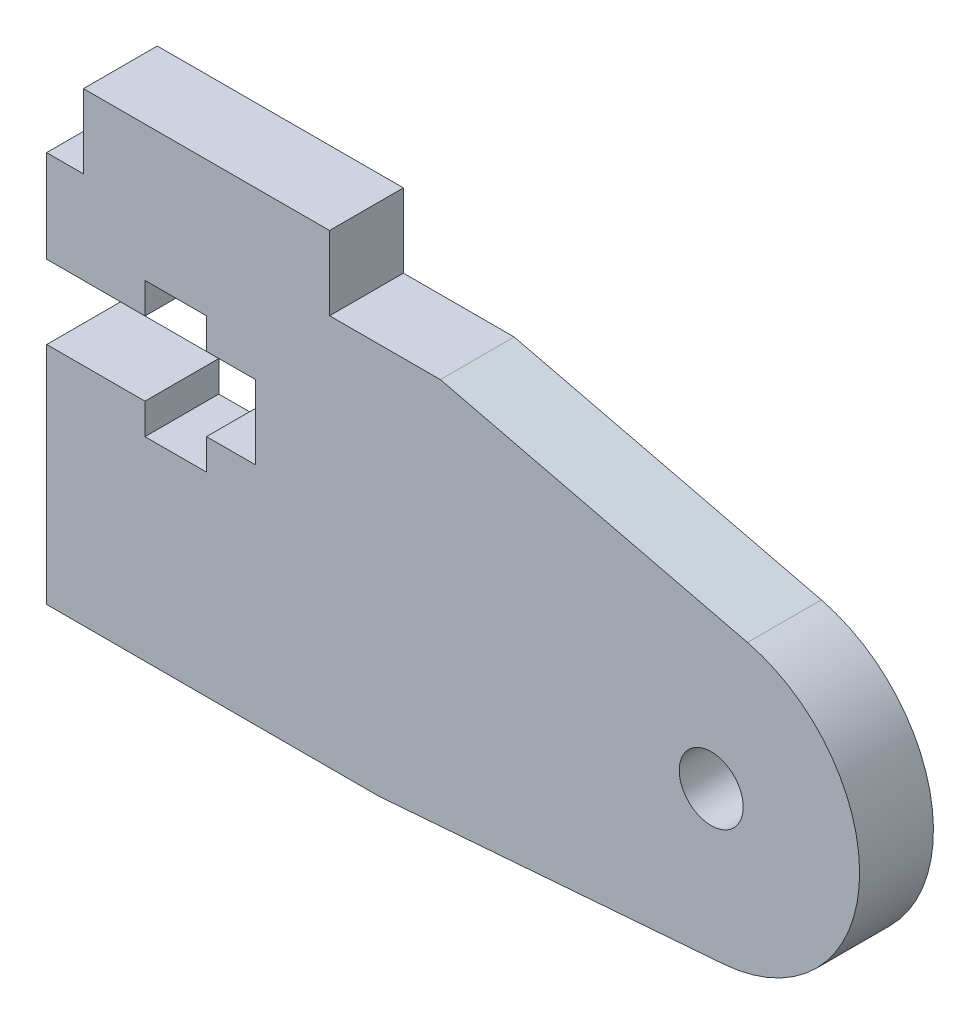
ISO-10303-21;
HEADER;
FILE_DESCRIPTION(('STEP AP214'),'2;1');
FILE_NAME('part.step','',(''),(''),'','','');
FILE_SCHEMA(('AUTOMOTIVE_DESIGN { 1 0 10303 214 1 1 1 1 }'));
ENDSEC;
DATA;
#1=APPLICATION_CONTEXT('core data for automotive mechanical design processes');
#2=APPLICATION_PROTOCOL_DEFINITION('international standard','automotive_design',2000,#1);
#3=PRODUCT_CONTEXT('',#1,'mechanical');
#4=PRODUCT('Part','Part','',(#3));
#5=PRODUCT_RELATED_PRODUCT_CATEGORY('part','',(#4));
#6=PRODUCT_DEFINITION_FORMATION('','',#4);
#7=PRODUCT_DEFINITION_CONTEXT('part definition',#1,'design');
#8=PRODUCT_DEFINITION('design','',#6,#7);
#9=PRODUCT_DEFINITION_SHAPE('','',#8);
#10=(LENGTH_UNIT() NAMED_UNIT(*) SI_UNIT(.MILLI.,.METRE.));
#11=(NAMED_UNIT(*) PLANE_ANGLE_UNIT() SI_UNIT($,.RADIAN.));
#12=(NAMED_UNIT(*) SI_UNIT($,.STERADIAN.) SOLID_ANGLE_UNIT());
#13=UNCERTAINTY_MEASURE_WITH_UNIT(LENGTH_MEASURE(1.E-05),#10,'distance_accuracy_value','');
#14=(GEOMETRIC_REPRESENTATION_CONTEXT(3) GLOBAL_UNCERTAINTY_ASSIGNED_CONTEXT((#13)) GLOBAL_UNIT_ASSIGNED_CONTEXT((#10,
#11,#12)) REPRESENTATION_CONTEXT('',''));
#15=CARTESIAN_POINT('',(0.,0.,0.));
#16=DIRECTION('',(0.,0.,1.));
#17=DIRECTION('',(1.,0.,0.));
#18=AXIS2_PLACEMENT_3D('',#15,#16,#17);
#19=CARTESIAN_POINT('',(237.032145776657,76.1590952958607,3.));
#20=DIRECTION('',(0.,0.,-1.));
#21=DIRECTION('',(-1.,0.,0.));
#22=AXIS2_PLACEMENT_3D('',#19,#20,#21);
#23=PLANE('',#22);
#24=DIRECTION('',(-0.999999690037696,-0.000787352850854752,0.));
#25=VECTOR('',#24,1.);
#26=CARTESIAN_POINT('',(218.49263232379,78.2356668376269,3.));
#27=LINE('',#26,#25);
#28=CARTESIAN_POINT('',(218.49263232379,78.2356668376269,3.));
#29=VERTEX_POINT('',#28);
#30=CARTESIAN_POINT('',(216.492632943714,78.2340921319252,3.));
#31=VERTEX_POINT('',#30);
#32=EDGE_CURVE('E257',#29,#31,#27,.T.);
#33=ORIENTED_EDGE('',*,*,#32,.T.);
#34=DIRECTION('',(0.000787352850806175,-0.999999690037696,0.));
#35=VECTOR('',#34,1.);
#36=CARTESIAN_POINT('',(216.492632943714,78.2340921319252,3.));
#37=LINE('',#36,#35);
#38=CARTESIAN_POINT('',(216.493617134778,76.984092519378,3.));
#39=VERTEX_POINT('',#38);
#40=EDGE_CURVE('E135',#31,#39,#37,.T.);
#41=ORIENTED_EDGE('',*,*,#40,.T.);
#42=DIRECTION('',(-0.999999690037696,-0.000787352850806297,0.));
#43=VECTOR('',#42,1.);
#44=CARTESIAN_POINT('',(216.493617134778,76.984092519378,3.));
#45=LINE('',#44,#43);
#46=CARTESIAN_POINT('',(213.993617909684,76.982124137251,3.));
#47=VERTEX_POINT('',#46);
#48=EDGE_CURVE('E314',#39,#47,#45,.T.);
#49=ORIENTED_EDGE('',*,*,#48,.T.);
#50=DIRECTION('',(-0.000787352850783962,0.999999690037696,0.));
#51=VECTOR('',#50,1.);
#52=CARTESIAN_POINT('',(213.993617909684,76.982124137251,3.));
#53=LINE('',#52,#51);
#54=CARTESIAN_POINT('',(213.992633718621,78.2321237497982,3.));
#55=VERTEX_POINT('',#54);
#56=EDGE_CURVE('E333',#47,#55,#53,.T.);
#57=ORIENTED_EDGE('',*,*,#56,.T.);
#58=DIRECTION('',(-0.999999690037695,-0.000787352852058484,0.));
#59=VECTOR('',#58,1.);
#60=CARTESIAN_POINT('',(213.992633718621,78.2321237497982,3.));
#61=LINE('',#60,#59);
#62=CARTESIAN_POINT('',(210.000112684434,78.2289802260007,3.));
#63=VERTEX_POINT('',#62);
#64=EDGE_CURVE('E330',#55,#63,#61,.T.);
#65=ORIENTED_EDGE('',*,*,#64,.T.);
#66=DIRECTION('',(-2.68532884352199E-05,-0.999999999639451,0.));
#67=VECTOR('',#66,1.);
#68=CARTESIAN_POINT('',(210.000112684434,78.2289802260007,3.));
#69=LINE('',#68,#67);
#70=CARTESIAN_POINT('',(209.999867004229,69.08,3.));
#71=VERTEX_POINT('',#70);
#72=EDGE_CURVE('E332',#63,#71,#69,.T.);
#73=ORIENTED_EDGE('',*,*,#72,.T.);
#74=DIRECTION('',(1.,0.,0.));
#75=VECTOR('',#74,1.);
#76=CARTESIAN_POINT('',(209.999867004229,69.08,3.));
#77=LINE('',#76,#75);
#78=CARTESIAN_POINT('',(223.4882426402,69.08,3.));
#79=VERTEX_POINT('',#78);
#80=EDGE_CURVE('E335',#71,#79,#77,.T.);
#81=ORIENTED_EDGE('',*,*,#80,.T.);
#82=DIRECTION('',(0.996947099942349,0.0780799584819332,0.));
#83=VECTOR('',#82,1.);
#84=CARTESIAN_POINT('',(223.4882426402,69.08,3.));
#85=LINE('',#84,#83);
#86=CARTESIAN_POINT('',(237.517934203416,70.1787922376559,3.));
#87=VERTEX_POINT('',#86);
#88=EDGE_CURVE('E341',#79,#87,#85,.T.);
#89=ORIENTED_EDGE('',*,*,#88,.T.);
#90=CARTESIAN_POINT('',(237.032145776657,76.1590952958607,3.));
#91=DIRECTION('',(0.,0.,1.));
#92=DIRECTION('',(-1.,0.,0.));
#93=AXIS2_PLACEMENT_3D('',#90,#91,#92);
#94=CIRCLE('',#93,6.00000125529538);
#95=CARTESIAN_POINT('',(238.477244303843,81.9824710617094,3.));
#96=VERTEX_POINT('',#95);
#97=EDGE_CURVE('E343',#87,#96,#94,.T.);
#98=ORIENTED_EDGE('',*,*,#97,.T.);
#99=DIRECTION('',(-0.972152676146553,0.23434840358128,0.));
#100=VECTOR('',#99,1.);
#101=CARTESIAN_POINT('',(238.477244303843,81.9824710617094,3.));
#102=LINE('',#101,#100);
#103=CARTESIAN_POINT('',(225.994777469297,84.9915109452669,3.));
#104=VERTEX_POINT('',#103);
#105=EDGE_CURVE('E345',#96,#104,#102,.T.);
#106=ORIENTED_EDGE('',*,*,#105,.T.);
#107=DIRECTION('',(-0.999999690037696,-0.000787352850732143,0.));
#108=VECTOR('',#107,1.);
#109=CARTESIAN_POINT('',(225.994777469297,84.9915109452669,3.));
#110=LINE('',#109,#108);
#111=CARTESIAN_POINT('',(221.494778864126,84.9879678574386,3.));
#112=VERTEX_POINT('',#111);
#113=EDGE_CURVE('E347',#104,#112,#110,.T.);
#114=ORIENTED_EDGE('',*,*,#113,.T.);
#115=DIRECTION('',(-0.00078735285083274,0.999999690037696,0.));
#116=VECTOR('',#115,1.);
#117=CARTESIAN_POINT('',(221.494778864126,84.9879678574386,3.));
#118=LINE('',#117,#116);
#119=CARTESIAN_POINT('',(221.492416805574,87.9879669275564,3.));
#120=VERTEX_POINT('',#119);
#121=EDGE_CURVE('E349',#112,#120,#118,.T.);
#122=ORIENTED_EDGE('',*,*,#121,.T.);
#123=DIRECTION('',(-0.999999690037696,-0.000787352850811783,0.));
#124=VECTOR('',#123,1.);
#125=CARTESIAN_POINT('',(211.492419905197,87.9800933990483,3.));
#126=LINE('',#125,#124);
#127=CARTESIAN_POINT('',(211.492419905197,87.9800933990483,3.));
#128=VERTEX_POINT('',#127);
#129=EDGE_CURVE('E351',#120,#128,#126,.T.);
#130=ORIENTED_EDGE('',*,*,#129,.T.);
#131=DIRECTION('',(0.000787352850787719,-0.999999690037696,0.));
#132=VECTOR('',#131,1.);
#133=CARTESIAN_POINT('',(211.49478196375,84.9800943289352,3.));
#134=LINE('',#133,#132);
#135=CARTESIAN_POINT('',(211.49478196375,84.9800943289352,3.));
#136=VERTEX_POINT('',#135);
#137=EDGE_CURVE('E353',#128,#136,#134,.T.);
#138=ORIENTED_EDGE('',*,*,#137,.T.);
#139=DIRECTION('',(-0.999999690037696,-0.000787352850800912,0.));
#140=VECTOR('',#139,1.);
#141=CARTESIAN_POINT('',(209.9947824287,84.978913299659,3.));
#142=LINE('',#141,#140);
#143=CARTESIAN_POINT('',(209.9947824287,84.978913299659,3.));
#144=VERTEX_POINT('',#143);
#145=EDGE_CURVE('E355',#136,#144,#142,.T.);
#146=ORIENTED_EDGE('',*,*,#145,.T.);
#147=DIRECTION('',(0.00079024558216566,-0.999999687755911,0.));
#148=VECTOR('',#147,1.);
#149=CARTESIAN_POINT('',(209.997745798408,81.2289792923177,3.));
#150=LINE('',#149,#148);
#151=CARTESIAN_POINT('',(209.997745798408,81.2289792923177,3.));
#152=VERTEX_POINT('',#151);
#153=EDGE_CURVE('E357',#144,#152,#150,.T.);
#154=ORIENTED_EDGE('',*,*,#153,.T.);
#155=DIRECTION('',(0.999999690037696,0.000787352850788518,0.));
#156=VECTOR('',#155,1.);
#157=CARTESIAN_POINT('',(209.997745798408,81.2289792923177,3.));
#158=LINE('',#157,#156);
#159=CARTESIAN_POINT('',(213.997733687767,81.2321286951617,3.));
#160=VERTEX_POINT('',#159);
#161=EDGE_CURVE('E359',#152,#160,#158,.T.);
#162=ORIENTED_EDGE('',*,*,#161,.T.);
#163=DIRECTION('',(-0.000787352850761819,0.999999690037696,0.));
#164=VECTOR('',#163,1.);
#165=CARTESIAN_POINT('',(213.997733687767,81.2321286951617,3.));
#166=LINE('',#165,#164);
#167=CARTESIAN_POINT('',(213.996749496704,82.4821283077088,3.));
#168=VERTEX_POINT('',#167);
#169=EDGE_CURVE('E361',#160,#168,#166,.T.);
#170=ORIENTED_EDGE('',*,*,#169,.T.);
#171=DIRECTION('',(0.999999690037696,0.000787352850760506,0.));
#172=VECTOR('',#171,1.);
#173=CARTESIAN_POINT('',(213.996749496704,82.4821283077088,3.));
#174=LINE('',#173,#172);
#175=CARTESIAN_POINT('',(216.489286694099,82.4840908145851,3.));
#176=VERTEX_POINT('',#175);
#177=EDGE_CURVE('E196',#168,#176,#174,.T.);
#178=ORIENTED_EDGE('',*,*,#177,.T.);
#179=DIRECTION('',(0.000787352850828563,-0.999999690037696,0.));
#180=VECTOR('',#179,1.);
#181=CARTESIAN_POINT('',(216.489286694099,82.4840908145851,3.));
#182=LINE('',#181,#180);
#183=CARTESIAN_POINT('',(216.490270885163,81.2340912020382,3.));
#184=VERTEX_POINT('',#183);
#185=EDGE_CURVE('E190',#176,#184,#182,.T.);
#186=ORIENTED_EDGE('',*,*,#185,.T.);
#187=DIRECTION('',(0.999999690037696,0.000787352850854959,0.));
#188=VECTOR('',#187,1.);
#189=CARTESIAN_POINT('',(216.490270885163,81.2340912020382,3.));
#190=LINE('',#189,#188);
#191=CARTESIAN_POINT('',(218.490270265237,81.2356659077399,3.));
#192=VERTEX_POINT('',#191);
#193=EDGE_CURVE('E194',#184,#192,#190,.T.);
#194=ORIENTED_EDGE('',*,*,#193,.T.);
#195=DIRECTION('',(0.000787352850834,-0.999999690037696,0.));
#196=VECTOR('',#195,1.);
#197=CARTESIAN_POINT('',(218.490270265237,81.2356659077399,3.));
#198=LINE('',#197,#196);
#199=EDGE_CURVE('E50',#192,#29,#198,.T.);
#200=ORIENTED_EDGE('',*,*,#199,.T.);
#201=EDGE_LOOP('',(#33,#41,#49,#57,#65,#73,#81,#89,#98,#106,#114,#122,#130,#138,#146,#154,#162,
#170,#178,#186,#194,#200));
#202=FACE_BOUND('',#201,.T.);
#203=CARTESIAN_POINT('',(237.001781500083,76.1001745852953,3.));
#204=DIRECTION('',(0.,0.,1.));
#205=DIRECTION('',(1.,0.,0.));
#206=AXIS2_PLACEMENT_3D('',#203,#204,#205);
#207=CIRCLE('',#206,1.30000000000001);
#208=CARTESIAN_POINT('',(238.301781500083,76.1001745852953,3.));
#209=VERTEX_POINT('',#208);
#210=EDGE_CURVE('E218',#209,#209,#207,.T.);
#211=ORIENTED_EDGE('',*,*,#210,.F.);
#212=EDGE_LOOP('',(#211));
#213=FACE_BOUND('',#212,.T.);
#214=ADVANCED_FACE('F33',(#202,#213),#23,.F.);
#215=CARTESIAN_POINT('',(237.032145776657,76.1590952958607,0.));
#216=DIRECTION('',(0.,0.,-1.));
#217=DIRECTION('',(-1.,0.,0.));
#218=AXIS2_PLACEMENT_3D('',#215,#216,#217);
#219=PLANE('',#218);
#220=DIRECTION('',(-0.999999690037696,-0.000787352850854752,0.));
#221=VECTOR('',#220,1.);
#222=CARTESIAN_POINT('',(218.49263232379,78.2356668376269,0.));
#223=LINE('',#222,#221);
#224=CARTESIAN_POINT('',(218.49263232379,78.2356668376269,0.));
#225=VERTEX_POINT('',#224);
#226=CARTESIAN_POINT('',(216.492632943714,78.2340921319252,0.));
#227=VERTEX_POINT('',#226);
#228=EDGE_CURVE('E214',#225,#227,#223,.T.);
#229=ORIENTED_EDGE('',*,*,#228,.F.);
#230=DIRECTION('',(0.000787352850834,-0.999999690037696,0.));
#231=VECTOR('',#230,1.);
#232=CARTESIAN_POINT('',(218.490270265237,81.2356659077399,0.));
#233=LINE('',#232,#231);
#234=CARTESIAN_POINT('',(218.490270265237,81.2356659077399,0.));
#235=VERTEX_POINT('',#234);
#236=EDGE_CURVE('E127',#235,#225,#233,.T.);
#237=ORIENTED_EDGE('',*,*,#236,.F.);
#238=DIRECTION('',(0.999999690037696,0.000787352850854959,0.));
#239=VECTOR('',#238,1.);
#240=CARTESIAN_POINT('',(216.490270885163,81.2340912020382,0.));
#241=LINE('',#240,#239);
#242=CARTESIAN_POINT('',(216.490270885163,81.2340912020382,0.));
#243=VERTEX_POINT('',#242);
#244=EDGE_CURVE('E121',#243,#235,#241,.T.);
#245=ORIENTED_EDGE('',*,*,#244,.F.);
#246=DIRECTION('',(0.000787352850828563,-0.999999690037696,0.));
#247=VECTOR('',#246,1.);
#248=CARTESIAN_POINT('',(216.489286694099,82.4840908145851,0.));
#249=LINE('',#248,#247);
#250=CARTESIAN_POINT('',(216.489286694099,82.4840908145851,0.));
#251=VERTEX_POINT('',#250);
#252=EDGE_CURVE('E204',#251,#243,#249,.T.);
#253=ORIENTED_EDGE('',*,*,#252,.F.);
#254=DIRECTION('',(0.999999690037696,0.000787352850760506,0.));
#255=VECTOR('',#254,1.);
#256=CARTESIAN_POINT('',(213.996749496704,82.4821283077088,0.));
#257=LINE('',#256,#255);
#258=CARTESIAN_POINT('',(213.996749496704,82.4821283077088,0.));
#259=VERTEX_POINT('',#258);
#260=EDGE_CURVE('E252',#259,#251,#257,.T.);
#261=ORIENTED_EDGE('',*,*,#260,.F.);
#262=DIRECTION('',(-0.000787352850761819,0.999999690037696,0.));
#263=VECTOR('',#262,1.);
#264=CARTESIAN_POINT('',(213.997733687767,81.2321286951617,0.));
#265=LINE('',#264,#263);
#266=CARTESIAN_POINT('',(213.997733687767,81.2321286951617,0.));
#267=VERTEX_POINT('',#266);
#268=EDGE_CURVE('E250',#267,#259,#265,.T.);
#269=ORIENTED_EDGE('',*,*,#268,.F.);
#270=DIRECTION('',(0.999999690037696,0.000787352850788518,0.));
#271=VECTOR('',#270,1.);
#272=CARTESIAN_POINT('',(209.997745798408,81.2289792923177,0.));
#273=LINE('',#272,#271);
#274=CARTESIAN_POINT('',(209.997745798408,81.2289792923177,0.));
#275=VERTEX_POINT('',#274);
#276=EDGE_CURVE('E248',#275,#267,#273,.T.);
#277=ORIENTED_EDGE('',*,*,#276,.F.);
#278=DIRECTION('',(0.00079024558216566,-0.999999687755911,0.));
#279=VECTOR('',#278,1.);
#280=CARTESIAN_POINT('',(209.997745798408,81.2289792923177,0.));
#281=LINE('',#280,#279);
#282=CARTESIAN_POINT('',(209.9947824287,84.978913299659,0.));
#283=VERTEX_POINT('',#282);
#284=EDGE_CURVE('E246',#283,#275,#281,.T.);
#285=ORIENTED_EDGE('',*,*,#284,.F.);
#286=DIRECTION('',(-0.999999690037696,-0.000787352850800912,0.));
#287=VECTOR('',#286,1.);
#288=CARTESIAN_POINT('',(209.9947824287,84.978913299659,0.));
#289=LINE('',#288,#287);
#290=CARTESIAN_POINT('',(211.49478196375,84.9800943289352,0.));
#291=VERTEX_POINT('',#290);
#292=EDGE_CURVE('E244',#291,#283,#289,.T.);
#293=ORIENTED_EDGE('',*,*,#292,.F.);
#294=DIRECTION('',(0.000787352850787719,-0.999999690037696,0.));
#295=VECTOR('',#294,1.);
#296=CARTESIAN_POINT('',(211.49478196375,84.9800943289352,0.));
#297=LINE('',#296,#295);
#298=CARTESIAN_POINT('',(211.492419905197,87.9800933990483,0.));
#299=VERTEX_POINT('',#298);
#300=EDGE_CURVE('E242',#299,#291,#297,.T.);
#301=ORIENTED_EDGE('',*,*,#300,.F.);
#302=DIRECTION('',(-0.999999690037696,-0.000787352850811783,0.));
#303=VECTOR('',#302,1.);
#304=CARTESIAN_POINT('',(211.492419905197,87.9800933990483,0.));
#305=LINE('',#304,#303);
#306=CARTESIAN_POINT('',(221.492416805574,87.9879669275564,0.));
#307=VERTEX_POINT('',#306);
#308=EDGE_CURVE('E240',#307,#299,#305,.T.);
#309=ORIENTED_EDGE('',*,*,#308,.F.);
#310=DIRECTION('',(-0.00078735285083274,0.999999690037696,0.));
#311=VECTOR('',#310,1.);
#312=CARTESIAN_POINT('',(221.494778864126,84.9879678574386,0.));
#313=LINE('',#312,#311);
#314=CARTESIAN_POINT('',(221.494778864126,84.9879678574386,0.));
#315=VERTEX_POINT('',#314);
#316=EDGE_CURVE('E238',#315,#307,#313,.T.);
#317=ORIENTED_EDGE('',*,*,#316,.F.);
#318=DIRECTION('',(-0.999999690037696,-0.000787352850732143,0.));
#319=VECTOR('',#318,1.);
#320=CARTESIAN_POINT('',(225.994777469297,84.9915109452669,0.));
#321=LINE('',#320,#319);
#322=CARTESIAN_POINT('',(225.994777469297,84.9915109452669,0.));
#323=VERTEX_POINT('',#322);
#324=EDGE_CURVE('E236',#323,#315,#321,.T.);
#325=ORIENTED_EDGE('',*,*,#324,.F.);
#326=DIRECTION('',(-0.972152676146553,0.23434840358128,0.));
#327=VECTOR('',#326,1.);
#328=CARTESIAN_POINT('',(238.477244303843,81.9824710617094,0.));
#329=LINE('',#328,#327);
#330=CARTESIAN_POINT('',(238.477244303843,81.9824710617094,0.));
#331=VERTEX_POINT('',#330);
#332=EDGE_CURVE('E234',#331,#323,#329,.T.);
#333=ORIENTED_EDGE('',*,*,#332,.F.);
#334=CARTESIAN_POINT('',(237.032145776657,76.1590952958607,0.));
#335=DIRECTION('',(0.,0.,1.));
#336=DIRECTION('',(-1.,0.,0.));
#337=AXIS2_PLACEMENT_3D('',#334,#335,#336);
#338=CIRCLE('',#337,6.00000125529538);
#339=CARTESIAN_POINT('',(237.517934203416,70.1787922376559,0.));
#340=VERTEX_POINT('',#339);
#341=EDGE_CURVE('E232',#340,#331,#338,.T.);
#342=ORIENTED_EDGE('',*,*,#341,.F.);
#343=DIRECTION('',(0.996947099942349,0.0780799584819332,0.));
#344=VECTOR('',#343,1.);
#345=CARTESIAN_POINT('',(223.4882426402,69.08,0.));
#346=LINE('',#345,#344);
#347=CARTESIAN_POINT('',(223.4882426402,69.08,0.));
#348=VERTEX_POINT('',#347);
#349=EDGE_CURVE('E230',#348,#340,#346,.T.);
#350=ORIENTED_EDGE('',*,*,#349,.F.);
#351=DIRECTION('',(1.,0.,0.));
#352=VECTOR('',#351,1.);
#353=CARTESIAN_POINT('',(209.999867004229,69.08,0.));
#354=LINE('',#353,#352);
#355=CARTESIAN_POINT('',(209.999867004229,69.08,0.));
#356=VERTEX_POINT('',#355);
#357=EDGE_CURVE('E228',#356,#348,#354,.T.);
#358=ORIENTED_EDGE('',*,*,#357,.F.);
#359=DIRECTION('',(-2.68532884352199E-05,-0.999999999639451,0.));
#360=VECTOR('',#359,1.);
#361=CARTESIAN_POINT('',(210.000112684434,78.2289802260007,0.));
#362=LINE('',#361,#360);
#363=CARTESIAN_POINT('',(210.000112684434,78.2289802260007,0.));
#364=VERTEX_POINT('',#363);
#365=EDGE_CURVE('E226',#364,#356,#362,.T.);
#366=ORIENTED_EDGE('',*,*,#365,.F.);
#367=DIRECTION('',(-0.999999690037695,-0.000787352852058484,0.));
#368=VECTOR('',#367,1.);
#369=CARTESIAN_POINT('',(213.992633718621,78.2321237497982,0.));
#370=LINE('',#369,#368);
#371=CARTESIAN_POINT('',(213.992633718621,78.2321237497982,0.));
#372=VERTEX_POINT('',#371);
#373=EDGE_CURVE('E224',#372,#364,#370,.T.);
#374=ORIENTED_EDGE('',*,*,#373,.F.);
#375=DIRECTION('',(-0.000787352850783962,0.999999690037696,0.));
#376=VECTOR('',#375,1.);
#377=CARTESIAN_POINT('',(213.993617909684,76.982124137251,0.));
#378=LINE('',#377,#376);
#379=CARTESIAN_POINT('',(213.993617909684,76.982124137251,0.));
#380=VERTEX_POINT('',#379);
#381=EDGE_CURVE('E222',#380,#372,#378,.T.);
#382=ORIENTED_EDGE('',*,*,#381,.F.);
#383=DIRECTION('',(-0.999999690037696,-0.000787352850806297,0.));
#384=VECTOR('',#383,1.);
#385=CARTESIAN_POINT('',(216.493617134778,76.984092519378,0.));
#386=LINE('',#385,#384);
#387=CARTESIAN_POINT('',(216.493617134778,76.984092519378,0.));
#388=VERTEX_POINT('',#387);
#389=EDGE_CURVE('E220',#388,#380,#386,.T.);
#390=ORIENTED_EDGE('',*,*,#389,.F.);
#391=DIRECTION('',(0.000787352850806175,-0.999999690037696,0.));
#392=VECTOR('',#391,1.);
#393=CARTESIAN_POINT('',(216.492632943714,78.2340921319252,0.));
#394=LINE('',#393,#392);
#395=EDGE_CURVE('E217',#227,#388,#394,.T.);
#396=ORIENTED_EDGE('',*,*,#395,.F.);
#397=EDGE_LOOP('',(#229,#237,#245,#253,#261,#269,#277,#285,#293,#301,#309,#317,#325,#333,#342,
#350,#358,#366,#374,#382,#390,#396));
#398=FACE_BOUND('',#397,.T.);
#399=CARTESIAN_POINT('',(237.001781500083,76.1001745852953,0.));
#400=DIRECTION('',(0.,0.,1.));
#401=DIRECTION('',(1.,0.,0.));
#402=AXIS2_PLACEMENT_3D('',#399,#400,#401);
#403=CIRCLE('',#402,1.30000000000001);
#404=CARTESIAN_POINT('',(238.301781500083,76.1001745852953,0.));
#405=VERTEX_POINT('',#404);
#406=EDGE_CURVE('E638',#405,#405,#403,.T.);
#407=ORIENTED_EDGE('',*,*,#406,.T.);
#408=EDGE_LOOP('',(#407));
#409=FACE_BOUND('',#408,.T.);
#410=ADVANCED_FACE('F318',(#398,#409),#219,.T.);
#411=CARTESIAN_POINT('',(218.49263232379,78.2356668376269,3.));
#412=DIRECTION('',(0.000787352850854752,-0.999999690037696,0.));
#413=DIRECTION('',(0.999999690037696,0.000787352850854752,0.));
#414=AXIS2_PLACEMENT_3D('',#411,#412,#413);
#415=PLANE('',#414);
#416=ORIENTED_EDGE('',*,*,#228,.T.);
#417=DIRECTION('',(0.,0.,-1.));
#418=VECTOR('',#417,1.);
#419=CARTESIAN_POINT('',(216.492632943714,78.2340921319252,3.));
#420=LINE('',#419,#418);
#421=EDGE_CURVE('E11',#31,#227,#420,.T.);
#422=ORIENTED_EDGE('',*,*,#421,.F.);
#423=ORIENTED_EDGE('',*,*,#32,.F.);
#424=DIRECTION('',(0.,0.,-1.));
#425=VECTOR('',#424,1.);
#426=CARTESIAN_POINT('',(218.49263232379,78.2356668376269,3.));
#427=LINE('',#426,#425);
#428=EDGE_CURVE('E210',#29,#225,#427,.T.);
#429=ORIENTED_EDGE('',*,*,#428,.T.);
#430=EDGE_LOOP('',(#416,#422,#423,#429));
#431=FACE_BOUND('',#430,.T.);
#432=ADVANCED_FACE('F35',(#431),#415,.F.);
#433=CARTESIAN_POINT('',(216.492632943714,78.2340921319252,3.));
#434=DIRECTION('',(0.999999690037696,0.000787352850806175,0.));
#435=DIRECTION('',(-0.000787352850806175,0.999999690037696,0.));
#436=AXIS2_PLACEMENT_3D('',#433,#434,#435);
#437=PLANE('',#436);
#438=ORIENTED_EDGE('',*,*,#395,.T.);
#439=DIRECTION('',(0.,0.,-1.));
#440=VECTOR('',#439,1.);
#441=CARTESIAN_POINT('',(216.493617134778,76.984092519378,3.));
#442=LINE('',#441,#440);
#443=EDGE_CURVE('E42',#39,#388,#442,.T.);
#444=ORIENTED_EDGE('',*,*,#443,.F.);
#445=ORIENTED_EDGE('',*,*,#40,.F.);
#446=ORIENTED_EDGE('',*,*,#421,.T.);
#447=EDGE_LOOP('',(#438,#444,#445,#446));
#448=FACE_BOUND('',#447,.T.);
#449=ADVANCED_FACE('F395',(#448),#437,.F.);
#450=CARTESIAN_POINT('',(216.493617134778,76.984092519378,3.));
#451=DIRECTION('',(0.000787352850806297,-0.999999690037696,0.));
#452=DIRECTION('',(0.999999690037696,0.000787352850806297,0.));
#453=AXIS2_PLACEMENT_3D('',#450,#451,#452);
#454=PLANE('',#453);
#455=ORIENTED_EDGE('',*,*,#389,.T.);
#456=DIRECTION('',(0.,0.,-1.));
#457=VECTOR('',#456,1.);
#458=CARTESIAN_POINT('',(213.993617909684,76.982124137251,3.));
#459=LINE('',#458,#457);
#460=EDGE_CURVE('E306',#47,#380,#459,.T.);
#461=ORIENTED_EDGE('',*,*,#460,.F.);
#462=ORIENTED_EDGE('',*,*,#48,.F.);
#463=ORIENTED_EDGE('',*,*,#443,.T.);
#464=EDGE_LOOP('',(#455,#461,#462,#463));
#465=FACE_BOUND('',#464,.T.);
#466=ADVANCED_FACE('F312',(#465),#454,.F.);
#467=CARTESIAN_POINT('',(213.993617909684,76.982124137251,3.));
#468=DIRECTION('',(-0.999999690037696,-0.000787352850783962,0.));
#469=DIRECTION('',(0.000787352850783962,-0.999999690037696,0.));
#470=AXIS2_PLACEMENT_3D('',#467,#468,#469);
#471=PLANE('',#470);
#472=ORIENTED_EDGE('',*,*,#381,.T.);
#473=DIRECTION('',(0.,0.,-1.));
#474=VECTOR('',#473,1.);
#475=CARTESIAN_POINT('',(213.992633718621,78.2321237497982,3.));
#476=LINE('',#475,#474);
#477=EDGE_CURVE('E303',#55,#372,#476,.T.);
#478=ORIENTED_EDGE('',*,*,#477,.F.);
#479=ORIENTED_EDGE('',*,*,#56,.F.);
#480=ORIENTED_EDGE('',*,*,#460,.T.);
#481=EDGE_LOOP('',(#472,#478,#479,#480));
#482=FACE_BOUND('',#481,.T.);
#483=ADVANCED_FACE('F324',(#482),#471,.F.);
#484=CARTESIAN_POINT('',(213.992633718621,78.2321237497982,3.));
#485=DIRECTION('',(0.000787352852058484,-0.999999690037695,0.));
#486=DIRECTION('',(0.999999690037695,0.000787352852058484,0.));
#487=AXIS2_PLACEMENT_3D('',#484,#485,#486);
#488=PLANE('',#487);
#489=ORIENTED_EDGE('',*,*,#373,.T.);
#490=DIRECTION('',(0.,0.,-1.));
#491=VECTOR('',#490,1.);
#492=CARTESIAN_POINT('',(210.000112684434,78.2289802260007,3.));
#493=LINE('',#492,#491);
#494=EDGE_CURVE('E300',#63,#364,#493,.T.);
#495=ORIENTED_EDGE('',*,*,#494,.F.);
#496=ORIENTED_EDGE('',*,*,#64,.F.);
#497=ORIENTED_EDGE('',*,*,#477,.T.);
#498=EDGE_LOOP('',(#489,#495,#496,#497));
#499=FACE_BOUND('',#498,.T.);
#500=ADVANCED_FACE('F328',(#499),#488,.F.);
#501=CARTESIAN_POINT('',(210.000112684434,78.2289802260007,3.));
#502=DIRECTION('',(0.99999999963945,-2.68532884352199E-05,0.));
#503=DIRECTION('',(2.68532884352199E-05,0.999999999639451,0.));
#504=AXIS2_PLACEMENT_3D('',#501,#502,#503);
#505=PLANE('',#504);
#506=ORIENTED_EDGE('',*,*,#365,.T.);
#507=DIRECTION('',(0.,0.,-1.));
#508=VECTOR('',#507,1.);
#509=CARTESIAN_POINT('',(209.999867004229,69.08,3.));
#510=LINE('',#509,#508);
#511=EDGE_CURVE('E297',#71,#356,#510,.T.);
#512=ORIENTED_EDGE('',*,*,#511,.F.);
#513=ORIENTED_EDGE('',*,*,#72,.F.);
#514=ORIENTED_EDGE('',*,*,#494,.T.);
#515=EDGE_LOOP('',(#506,#512,#513,#514));
#516=FACE_BOUND('',#515,.T.);
#517=ADVANCED_FACE('F408',(#516),#505,.F.);
#518=CARTESIAN_POINT('',(209.999867004229,69.08,3.));
#519=DIRECTION('',(0.,1.,0.));
#520=DIRECTION('',(0.,0.,1.));
#521=AXIS2_PLACEMENT_3D('',#518,#519,#520);
#522=PLANE('',#521);
#523=ORIENTED_EDGE('',*,*,#357,.T.);
#524=DIRECTION('',(0.,0.,-1.));
#525=VECTOR('',#524,1.);
#526=CARTESIAN_POINT('',(223.4882426402,69.08,3.));
#527=LINE('',#526,#525);
#528=EDGE_CURVE('E294',#79,#348,#527,.T.);
#529=ORIENTED_EDGE('',*,*,#528,.F.);
#530=ORIENTED_EDGE('',*,*,#80,.F.);
#531=ORIENTED_EDGE('',*,*,#511,.T.);
#532=EDGE_LOOP('',(#523,#529,#530,#531));
#533=FACE_BOUND('',#532,.T.);
#534=ADVANCED_FACE('F411',(#533),#522,.F.);
#535=CARTESIAN_POINT('',(223.4882426402,69.08,3.));
#536=DIRECTION('',(-0.0780799584819332,0.996947099942349,0.));
#537=DIRECTION('',(-0.996947099942349,-0.0780799584819332,0.));
#538=AXIS2_PLACEMENT_3D('',#535,#536,#537);
#539=PLANE('',#538);
#540=ORIENTED_EDGE('',*,*,#349,.T.);
#541=DIRECTION('',(0.,0.,-1.));
#542=VECTOR('',#541,1.);
#543=CARTESIAN_POINT('',(237.517934203416,70.1787922376559,3.));
#544=LINE('',#543,#542);
#545=EDGE_CURVE('E291',#87,#340,#544,.T.);
#546=ORIENTED_EDGE('',*,*,#545,.F.);
#547=ORIENTED_EDGE('',*,*,#88,.F.);
#548=ORIENTED_EDGE('',*,*,#528,.T.);
#549=EDGE_LOOP('',(#540,#546,#547,#548));
#550=FACE_BOUND('',#549,.T.);
#551=ADVANCED_FACE('F415',(#550),#539,.F.);
#552=CARTESIAN_POINT('',(237.032145776657,76.1590952958607,3.));
#553=DIRECTION('',(0.,0.,-1.));
#554=DIRECTION('',(-1.,0.,0.));
#555=AXIS2_PLACEMENT_3D('',#552,#553,#554);
#556=CYLINDRICAL_SURFACE('',#555,6.00000125529538);
#557=ORIENTED_EDGE('',*,*,#341,.T.);
#558=DIRECTION('',(0.,0.,-1.));
#559=VECTOR('',#558,1.);
#560=CARTESIAN_POINT('',(238.477244303843,81.9824710617094,3.));
#561=LINE('',#560,#559);
#562=EDGE_CURVE('E288',#96,#331,#561,.T.);
#563=ORIENTED_EDGE('',*,*,#562,.F.);
#564=ORIENTED_EDGE('',*,*,#97,.F.);
#565=ORIENTED_EDGE('',*,*,#545,.T.);
#566=EDGE_LOOP('',(#557,#563,#564,#565));
#567=FACE_BOUND('',#566,.T.);
#568=ADVANCED_FACE('F419',(#567),#556,.T.);
#569=CARTESIAN_POINT('',(238.477244303843,81.9824710617094,3.));
#570=DIRECTION('',(-0.23434840358128,-0.972152676146553,0.));
#571=DIRECTION('',(0.972152676146554,-0.23434840358128,0.));
#572=AXIS2_PLACEMENT_3D('',#569,#570,#571);
#573=PLANE('',#572);
#574=ORIENTED_EDGE('',*,*,#332,.T.);
#575=DIRECTION('',(0.,0.,-1.));
#576=VECTOR('',#575,1.);
#577=CARTESIAN_POINT('',(225.994777469297,84.9915109452669,3.));
#578=LINE('',#577,#576);
#579=EDGE_CURVE('E285',#104,#323,#578,.T.);
#580=ORIENTED_EDGE('',*,*,#579,.F.);
#581=ORIENTED_EDGE('',*,*,#105,.F.);
#582=ORIENTED_EDGE('',*,*,#562,.T.);
#583=EDGE_LOOP('',(#574,#580,#581,#582));
#584=FACE_BOUND('',#583,.T.);
#585=ADVANCED_FACE('F423',(#584),#573,.F.);
#586=CARTESIAN_POINT('',(225.994777469297,84.9915109452669,3.));
#587=DIRECTION('',(0.000787352850732142,-0.999999690037696,0.));
#588=DIRECTION('',(0.999999690037696,0.000787352850732143,0.));
#589=AXIS2_PLACEMENT_3D('',#586,#587,#588);
#590=PLANE('',#589);
#591=ORIENTED_EDGE('',*,*,#324,.T.);
#592=DIRECTION('',(0.,0.,-1.));
#593=VECTOR('',#592,1.);
#594=CARTESIAN_POINT('',(221.494778864126,84.9879678574386,3.));
#595=LINE('',#594,#593);
#596=EDGE_CURVE('E282',#112,#315,#595,.T.);
#597=ORIENTED_EDGE('',*,*,#596,.F.);
#598=ORIENTED_EDGE('',*,*,#113,.F.);
#599=ORIENTED_EDGE('',*,*,#579,.T.);
#600=EDGE_LOOP('',(#591,#597,#598,#599));
#601=FACE_BOUND('',#600,.T.);
#602=ADVANCED_FACE('F427',(#601),#590,.F.);
#603=CARTESIAN_POINT('',(221.494778864126,84.9879678574386,3.));
#604=DIRECTION('',(-0.999999690037696,-0.00078735285083274,0.));
#605=DIRECTION('',(0.00078735285083274,-0.999999690037696,0.));
#606=AXIS2_PLACEMENT_3D('',#603,#604,#605);
#607=PLANE('',#606);
#608=ORIENTED_EDGE('',*,*,#316,.T.);
#609=DIRECTION('',(0.,0.,-1.));
#610=VECTOR('',#609,1.);
#611=CARTESIAN_POINT('',(221.492416805574,87.9879669275564,3.));
#612=LINE('',#611,#610);
#613=EDGE_CURVE('E279',#120,#307,#612,.T.);
#614=ORIENTED_EDGE('',*,*,#613,.F.);
#615=ORIENTED_EDGE('',*,*,#121,.F.);
#616=ORIENTED_EDGE('',*,*,#596,.T.);
#617=EDGE_LOOP('',(#608,#614,#615,#616));
#618=FACE_BOUND('',#617,.T.);
#619=ADVANCED_FACE('F431',(#618),#607,.F.);
#620=CARTESIAN_POINT('',(211.492419905197,87.9800933990483,3.));
#621=DIRECTION('',(0.000787352850811783,-0.999999690037696,0.));
#622=DIRECTION('',(0.999999690037696,0.000787352850811783,0.));
#623=AXIS2_PLACEMENT_3D('',#620,#621,#622);
#624=PLANE('',#623);
#625=ORIENTED_EDGE('',*,*,#308,.T.);
#626=DIRECTION('',(0.,0.,-1.));
#627=VECTOR('',#626,1.);
#628=CARTESIAN_POINT('',(211.492419905197,87.9800933990483,3.));
#629=LINE('',#628,#627);
#630=EDGE_CURVE('E276',#128,#299,#629,.T.);
#631=ORIENTED_EDGE('',*,*,#630,.F.);
#632=ORIENTED_EDGE('',*,*,#129,.F.);
#633=ORIENTED_EDGE('',*,*,#613,.T.);
#634=EDGE_LOOP('',(#625,#631,#632,#633));
#635=FACE_BOUND('',#634,.T.);
#636=ADVANCED_FACE('F435',(#635),#624,.F.);
#637=CARTESIAN_POINT('',(211.49478196375,84.9800943289352,3.));
#638=DIRECTION('',(0.999999690037696,0.000787352850787719,0.));
#639=DIRECTION('',(-0.000787352850787719,0.999999690037696,0.));
#640=AXIS2_PLACEMENT_3D('',#637,#638,#639);
#641=PLANE('',#640);
#642=ORIENTED_EDGE('',*,*,#300,.T.);
#643=DIRECTION('',(0.,0.,-1.));
#644=VECTOR('',#643,1.);
#645=CARTESIAN_POINT('',(211.49478196375,84.9800943289352,3.));
#646=LINE('',#645,#644);
#647=EDGE_CURVE('E273',#136,#291,#646,.T.);
#648=ORIENTED_EDGE('',*,*,#647,.F.);
#649=ORIENTED_EDGE('',*,*,#137,.F.);
#650=ORIENTED_EDGE('',*,*,#630,.T.);
#651=EDGE_LOOP('',(#642,#648,#649,#650));
#652=FACE_BOUND('',#651,.T.);
#653=ADVANCED_FACE('F439',(#652),#641,.F.);
#654=CARTESIAN_POINT('',(209.9947824287,84.978913299659,3.));
#655=DIRECTION('',(0.000787352850800912,-0.999999690037696,0.));
#656=DIRECTION('',(0.999999690037696,0.000787352850800912,0.));
#657=AXIS2_PLACEMENT_3D('',#654,#655,#656);
#658=PLANE('',#657);
#659=ORIENTED_EDGE('',*,*,#292,.T.);
#660=DIRECTION('',(0.,0.,-1.));
#661=VECTOR('',#660,1.);
#662=CARTESIAN_POINT('',(209.9947824287,84.978913299659,3.));
#663=LINE('',#662,#661);
#664=EDGE_CURVE('E270',#144,#283,#663,.T.);
#665=ORIENTED_EDGE('',*,*,#664,.F.);
#666=ORIENTED_EDGE('',*,*,#145,.F.);
#667=ORIENTED_EDGE('',*,*,#647,.T.);
#668=EDGE_LOOP('',(#659,#665,#666,#667));
#669=FACE_BOUND('',#668,.T.);
#670=ADVANCED_FACE('F443',(#669),#658,.F.);
#671=CARTESIAN_POINT('',(209.997745798408,81.2289792923177,3.));
#672=DIRECTION('',(0.999999687755911,0.00079024558216566,0.));
#673=DIRECTION('',(-0.00079024558216566,0.999999687755911,0.));
#674=AXIS2_PLACEMENT_3D('',#671,#672,#673);
#675=PLANE('',#674);
#676=ORIENTED_EDGE('',*,*,#284,.T.);
#677=DIRECTION('',(0.,0.,-1.));
#678=VECTOR('',#677,1.);
#679=CARTESIAN_POINT('',(209.997745798408,81.2289792923177,3.));
#680=LINE('',#679,#678);
#681=EDGE_CURVE('E267',#152,#275,#680,.T.);
#682=ORIENTED_EDGE('',*,*,#681,.F.);
#683=ORIENTED_EDGE('',*,*,#153,.F.);
#684=ORIENTED_EDGE('',*,*,#664,.T.);
#685=EDGE_LOOP('',(#676,#682,#683,#684));
#686=FACE_BOUND('',#685,.T.);
#687=ADVANCED_FACE('F447',(#686),#675,.F.);
#688=CARTESIAN_POINT('',(209.997745798408,81.2289792923177,3.));
#689=DIRECTION('',(-0.000787352850788518,0.999999690037696,0.));
#690=DIRECTION('',(-0.999999690037696,-0.000787352850788518,0.));
#691=AXIS2_PLACEMENT_3D('',#688,#689,#690);
#692=PLANE('',#691);
#693=ORIENTED_EDGE('',*,*,#276,.T.);
#694=DIRECTION('',(0.,0.,-1.));
#695=VECTOR('',#694,1.);
#696=CARTESIAN_POINT('',(213.997733687767,81.2321286951617,3.));
#697=LINE('',#696,#695);
#698=EDGE_CURVE('E264',#160,#267,#697,.T.);
#699=ORIENTED_EDGE('',*,*,#698,.F.);
#700=ORIENTED_EDGE('',*,*,#161,.F.);
#701=ORIENTED_EDGE('',*,*,#681,.T.);
#702=EDGE_LOOP('',(#693,#699,#700,#701));
#703=FACE_BOUND('',#702,.T.);
#704=ADVANCED_FACE('F451',(#703),#692,.F.);
#705=CARTESIAN_POINT('',(213.997733687767,81.2321286951617,3.));
#706=DIRECTION('',(-0.999999690037696,-0.000787352850761819,0.));
#707=DIRECTION('',(0.000787352850761819,-0.999999690037696,0.));
#708=AXIS2_PLACEMENT_3D('',#705,#706,#707);
#709=PLANE('',#708);
#710=ORIENTED_EDGE('',*,*,#268,.T.);
#711=DIRECTION('',(0.,0.,-1.));
#712=VECTOR('',#711,1.);
#713=CARTESIAN_POINT('',(213.996749496704,82.4821283077088,3.));
#714=LINE('',#713,#712);
#715=EDGE_CURVE('E261',#168,#259,#714,.T.);
#716=ORIENTED_EDGE('',*,*,#715,.F.);
#717=ORIENTED_EDGE('',*,*,#169,.F.);
#718=ORIENTED_EDGE('',*,*,#698,.T.);
#719=EDGE_LOOP('',(#710,#716,#717,#718));
#720=FACE_BOUND('',#719,.T.);
#721=ADVANCED_FACE('F367',(#720),#709,.F.);
#722=CARTESIAN_POINT('',(213.996749496704,82.4821283077088,3.));
#723=DIRECTION('',(-0.000787352850760507,0.999999690037696,0.));
#724=DIRECTION('',(-0.999999690037696,-0.000787352850760507,0.));
#725=AXIS2_PLACEMENT_3D('',#722,#723,#724);
#726=PLANE('',#725);
#727=ORIENTED_EDGE('',*,*,#260,.T.);
#728=DIRECTION('',(0.,0.,-1.));
#729=VECTOR('',#728,1.);
#730=CARTESIAN_POINT('',(216.489286694099,82.4840908145851,3.));
#731=LINE('',#730,#729);
#732=EDGE_CURVE('E205',#176,#251,#731,.T.);
#733=ORIENTED_EDGE('',*,*,#732,.F.);
#734=ORIENTED_EDGE('',*,*,#177,.F.);
#735=ORIENTED_EDGE('',*,*,#715,.T.);
#736=EDGE_LOOP('',(#727,#733,#734,#735));
#737=FACE_BOUND('',#736,.T.);
#738=ADVANCED_FACE('F371',(#737),#726,.F.);
#739=CARTESIAN_POINT('',(216.489286694099,82.4840908145851,3.));
#740=DIRECTION('',(0.999999690037696,0.000787352850828563,0.));
#741=DIRECTION('',(-0.000787352850828563,0.999999690037696,0.));
#742=AXIS2_PLACEMENT_3D('',#739,#740,#741);
#743=PLANE('',#742);
#744=ORIENTED_EDGE('',*,*,#252,.T.);
#745=DIRECTION('',(0.,0.,-1.));
#746=VECTOR('',#745,1.);
#747=CARTESIAN_POINT('',(216.490270885163,81.2340912020382,3.));
#748=LINE('',#747,#746);
#749=EDGE_CURVE('E201',#184,#243,#748,.T.);
#750=ORIENTED_EDGE('',*,*,#749,.F.);
#751=ORIENTED_EDGE('',*,*,#185,.F.);
#752=ORIENTED_EDGE('',*,*,#732,.T.);
#753=EDGE_LOOP('',(#744,#750,#751,#752));
#754=FACE_BOUND('',#753,.T.);
#755=ADVANCED_FACE('F202',(#754),#743,.F.);
#756=CARTESIAN_POINT('',(216.490270885163,81.2340912020382,3.));
#757=DIRECTION('',(-0.000787352850854959,0.999999690037696,0.));
#758=DIRECTION('',(-0.999999690037696,-0.000787352850854959,0.));
#759=AXIS2_PLACEMENT_3D('',#756,#757,#758);
#760=PLANE('',#759);
#761=ORIENTED_EDGE('',*,*,#244,.T.);
#762=DIRECTION('',(0.,0.,-1.));
#763=VECTOR('',#762,1.);
#764=CARTESIAN_POINT('',(218.490270265237,81.2356659077399,3.));
#765=LINE('',#764,#763);
#766=EDGE_CURVE('E206',#192,#235,#765,.T.);
#767=ORIENTED_EDGE('',*,*,#766,.F.);
#768=ORIENTED_EDGE('',*,*,#193,.F.);
#769=ORIENTED_EDGE('',*,*,#749,.T.);
#770=EDGE_LOOP('',(#761,#767,#768,#769));
#771=FACE_BOUND('',#770,.T.);
#772=ADVANCED_FACE('F208',(#771),#760,.F.);
#773=CARTESIAN_POINT('',(218.490270265237,81.2356659077399,3.));
#774=DIRECTION('',(0.999999690037696,0.000787352850834,0.));
#775=DIRECTION('',(-0.000787352850834001,0.999999690037696,0.));
#776=AXIS2_PLACEMENT_3D('',#773,#774,#775);
#777=PLANE('',#776);
#778=ORIENTED_EDGE('',*,*,#236,.T.);
#779=ORIENTED_EDGE('',*,*,#428,.F.);
#780=ORIENTED_EDGE('',*,*,#199,.F.);
#781=ORIENTED_EDGE('',*,*,#766,.T.);
#782=EDGE_LOOP('',(#778,#779,#780,#781));
#783=FACE_BOUND('',#782,.T.);
#784=ADVANCED_FACE('F375',(#783),#777,.F.);
#785=CARTESIAN_POINT('',(237.001781500083,76.1001745852953,3.));
#786=DIRECTION('',(0.,0.,-1.));
#787=DIRECTION('',(-1.,0.,0.));
#788=AXIS2_PLACEMENT_3D('',#785,#786,#787);
#789=CYLINDRICAL_SURFACE('',#788,1.30000000000001);
#790=ORIENTED_EDGE('',*,*,#210,.T.);
#791=EDGE_LOOP('',(#790));
#792=FACE_BOUND('',#791,.T.);
#793=ORIENTED_EDGE('',*,*,#406,.F.);
#794=EDGE_LOOP('',(#793));
#795=FACE_BOUND('',#794,.T.);
#796=ADVANCED_FACE('F377',(#792,#795),#789,.F.);
#797=CLOSED_SHELL('',(#214,#410,#432,#449,#466,#483,#500,#517,#534,#551,#568,#585,#602,#619,
#636,#653,#670,#687,#704,#721,#738,#755,#772,#784,#796));
#798=MANIFOLD_SOLID_BREP('B2',#797);
#799=ADVANCED_BREP_SHAPE_REPRESENTATION('',(#18,#798),#14);
#800=SHAPE_DEFINITION_REPRESENTATION(#9,#799);
ENDSEC;
END-ISO-10303-21;
